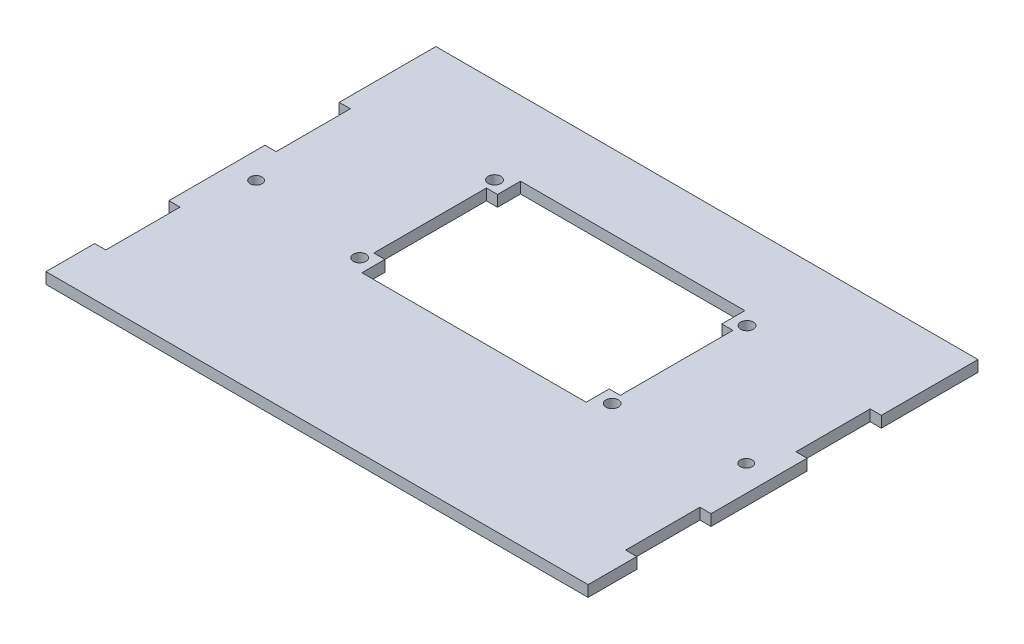
ISO-10303-21;
HEADER;
FILE_DESCRIPTION(('STEP AP214'),'2;1');
FILE_NAME('part.step','',(''),(''),'','','');
FILE_SCHEMA(('AUTOMOTIVE_DESIGN { 1 0 10303 214 1 1 1 1 }'));
ENDSEC;
DATA;
#1=APPLICATION_CONTEXT('core data for automotive mechanical design processes');
#2=APPLICATION_PROTOCOL_DEFINITION('international standard','automotive_design',2000,#1);
#3=PRODUCT_CONTEXT('',#1,'mechanical');
#4=PRODUCT('Part','Part','',(#3));
#5=PRODUCT_RELATED_PRODUCT_CATEGORY('part','',(#4));
#6=PRODUCT_DEFINITION_FORMATION('','',#4);
#7=PRODUCT_DEFINITION_CONTEXT('part definition',#1,'design');
#8=PRODUCT_DEFINITION('design','',#6,#7);
#9=PRODUCT_DEFINITION_SHAPE('','',#8);
#10=(LENGTH_UNIT() NAMED_UNIT(*) SI_UNIT(.MILLI.,.METRE.));
#11=(NAMED_UNIT(*) PLANE_ANGLE_UNIT() SI_UNIT($,.RADIAN.));
#12=(NAMED_UNIT(*) SI_UNIT($,.STERADIAN.) SOLID_ANGLE_UNIT());
#13=UNCERTAINTY_MEASURE_WITH_UNIT(LENGTH_MEASURE(1.E-05),#10,'distance_accuracy_value','');
#14=(GEOMETRIC_REPRESENTATION_CONTEXT(3) GLOBAL_UNCERTAINTY_ASSIGNED_CONTEXT((#13)) GLOBAL_UNIT_ASSIGNED_CONTEXT((#10,
#11,#12)) REPRESENTATION_CONTEXT('',''));
#15=CARTESIAN_POINT('',(0.,0.,0.));
#16=DIRECTION('',(0.,0.,1.));
#17=DIRECTION('',(1.,0.,0.));
#18=AXIS2_PLACEMENT_3D('',#15,#16,#17);
#19=CARTESIAN_POINT('',(-30.2,3.,10.22));
#20=DIRECTION('',(-1.,0.,0.));
#21=DIRECTION('',(0.,0.,1.));
#22=AXIS2_PLACEMENT_3D('',#19,#20,#21);
#23=PLANE('',#22);
#24=DIRECTION('',(0.,0.,-1.));
#25=VECTOR('',#24,1.);
#26=CARTESIAN_POINT('',(-30.2,3.,10.22));
#27=LINE('',#26,#25);
#28=CARTESIAN_POINT('',(-30.2,3.,-26.3));
#29=VERTEX_POINT('',#28);
#30=CARTESIAN_POINT('',(-30.2,3.,-32.5));
#31=VERTEX_POINT('',#30);
#32=EDGE_CURVE('E358',#29,#31,#27,.T.);
#33=ORIENTED_EDGE('',*,*,#32,.F.);
#34=DIRECTION('',(0.,-1.,0.));
#35=VECTOR('',#34,1.);
#36=CARTESIAN_POINT('',(-30.2,3.,-26.3));
#37=LINE('',#36,#35);
#38=CARTESIAN_POINT('',(-30.2,0.,-26.3));
#39=VERTEX_POINT('',#38);
#40=EDGE_CURVE('E302',#29,#39,#37,.T.);
#41=ORIENTED_EDGE('',*,*,#40,.T.);
#42=DIRECTION('',(0.,0.,-1.));
#43=VECTOR('',#42,1.);
#44=CARTESIAN_POINT('',(-30.2,0.,10.22));
#45=LINE('',#44,#43);
#46=CARTESIAN_POINT('',(-30.2,0.,-32.5));
#47=VERTEX_POINT('',#46);
#48=EDGE_CURVE('E374',#39,#47,#45,.T.);
#49=ORIENTED_EDGE('',*,*,#48,.T.);
#50=DIRECTION('',(0.,-1.,0.));
#51=VECTOR('',#50,1.);
#52=CARTESIAN_POINT('',(-30.2,3.,-32.5));
#53=LINE('',#52,#51);
#54=EDGE_CURVE('E306',#31,#47,#53,.T.);
#55=ORIENTED_EDGE('',*,*,#54,.F.);
#56=EDGE_LOOP('',(#33,#41,#49,#55));
#57=FACE_BOUND('',#56,.T.);
#58=ADVANCED_FACE('F50',(#57),#23,.F.);
#59=CARTESIAN_POINT('',(30.2,3.,-32.5));
#60=DIRECTION('',(1.,0.,0.));
#61=DIRECTION('',(0.,0.,-1.));
#62=AXIS2_PLACEMENT_3D('',#59,#60,#61);
#63=PLANE('',#62);
#64=DIRECTION('',(0.,0.,1.));
#65=VECTOR('',#64,1.);
#66=CARTESIAN_POINT('',(30.2,3.,-32.5));
#67=LINE('',#66,#65);
#68=CARTESIAN_POINT('',(30.2,3.,4.01999999999999));
#69=VERTEX_POINT('',#68);
#70=CARTESIAN_POINT('',(30.2,3.,10.22));
#71=VERTEX_POINT('',#70);
#72=EDGE_CURVE('E390',#69,#71,#67,.T.);
#73=ORIENTED_EDGE('',*,*,#72,.F.);
#74=DIRECTION('',(0.,-1.,0.));
#75=VECTOR('',#74,1.);
#76=CARTESIAN_POINT('',(30.2,3.,4.01999999999999));
#77=LINE('',#76,#75);
#78=CARTESIAN_POINT('',(30.2,0.,4.01999999999999));
#79=VERTEX_POINT('',#78);
#80=EDGE_CURVE('E321',#69,#79,#77,.T.);
#81=ORIENTED_EDGE('',*,*,#80,.T.);
#82=DIRECTION('',(0.,0.,1.));
#83=VECTOR('',#82,1.);
#84=CARTESIAN_POINT('',(30.2,0.,-32.5));
#85=LINE('',#84,#83);
#86=CARTESIAN_POINT('',(30.2,0.,10.22));
#87=VERTEX_POINT('',#86);
#88=EDGE_CURVE('E378',#79,#87,#85,.T.);
#89=ORIENTED_EDGE('',*,*,#88,.T.);
#90=DIRECTION('',(0.,-1.,0.));
#91=VECTOR('',#90,1.);
#92=CARTESIAN_POINT('',(30.2,3.,10.22));
#93=LINE('',#92,#91);
#94=EDGE_CURVE('E359',#71,#87,#93,.T.);
#95=ORIENTED_EDGE('',*,*,#94,.F.);
#96=EDGE_LOOP('',(#73,#81,#89,#95));
#97=FACE_BOUND('',#96,.T.);
#98=ADVANCED_FACE('F724',(#97),#63,.F.);
#99=CARTESIAN_POINT('',(-73.,3.,52.5));
#100=DIRECTION('',(1.,0.,0.));
#101=DIRECTION('',(0.,0.,-1.));
#102=AXIS2_PLACEMENT_3D('',#99,#100,#101);
#103=PLANE('',#102);
#104=DIRECTION('',(0.,0.,1.));
#105=VECTOR('',#104,1.);
#106=CARTESIAN_POINT('',(-73.,0.,52.5));
#107=LINE('',#106,#105);
#108=CARTESIAN_POINT('',(-73.,0.,-6.46999999999998));
#109=VERTEX_POINT('',#108);
#110=CARTESIAN_POINT('',(-73.,0.,19.4));
#111=VERTEX_POINT('',#110);
#112=EDGE_CURVE('E543',#109,#111,#107,.T.);
#113=ORIENTED_EDGE('',*,*,#112,.T.);
#114=DIRECTION('',(0.,1.,0.));
#115=VECTOR('',#114,1.);
#116=CARTESIAN_POINT('',(-73.,-7.,19.4));
#117=LINE('',#116,#115);
#118=CARTESIAN_POINT('',(-73.,3.,19.4));
#119=VERTEX_POINT('',#118);
#120=EDGE_CURVE('E473',#111,#119,#117,.T.);
#121=ORIENTED_EDGE('',*,*,#120,.T.);
#122=DIRECTION('',(0.,0.,1.));
#123=VECTOR('',#122,1.);
#124=CARTESIAN_POINT('',(-73.,3.,52.5));
#125=LINE('',#124,#123);
#126=CARTESIAN_POINT('',(-73.,3.,-6.46999999999998));
#127=VERTEX_POINT('',#126);
#128=EDGE_CURVE('E524',#127,#119,#125,.T.);
#129=ORIENTED_EDGE('',*,*,#128,.F.);
#130=DIRECTION('',(0.,1.,0.));
#131=VECTOR('',#130,1.);
#132=CARTESIAN_POINT('',(-73.,-7.,-6.46999999999998));
#133=LINE('',#132,#131);
#134=EDGE_CURVE('E513',#109,#127,#133,.T.);
#135=ORIENTED_EDGE('',*,*,#134,.F.);
#136=EDGE_LOOP('',(#113,#121,#129,#135));
#137=FACE_BOUND('',#136,.T.);
#138=ADVANCED_FACE('F627',(#137),#103,.F.);
#139=CARTESIAN_POINT('',(-73.,0.,-52.5));
#140=VERTEX_POINT('',#139);
#141=CARTESIAN_POINT('',(-73.,0.,-26.47));
#142=VERTEX_POINT('',#141);
#143=EDGE_CURVE('E538',#140,#142,#107,.T.);
#144=ORIENTED_EDGE('',*,*,#143,.T.);
#145=DIRECTION('',(0.,1.,0.));
#146=VECTOR('',#145,1.);
#147=CARTESIAN_POINT('',(-73.,-7.,-26.47));
#148=LINE('',#147,#146);
#149=CARTESIAN_POINT('',(-73.,3.,-26.47));
#150=VERTEX_POINT('',#149);
#151=EDGE_CURVE('E505',#142,#150,#148,.T.);
#152=ORIENTED_EDGE('',*,*,#151,.T.);
#153=CARTESIAN_POINT('',(-73.,3.,-52.5));
#154=VERTEX_POINT('',#153);
#155=EDGE_CURVE('E519',#154,#150,#125,.T.);
#156=ORIENTED_EDGE('',*,*,#155,.F.);
#157=DIRECTION('',(0.,-1.,0.));
#158=VECTOR('',#157,1.);
#159=CARTESIAN_POINT('',(-73.,3.,-52.5));
#160=LINE('',#159,#158);
#161=EDGE_CURVE('E537',#154,#140,#160,.T.);
#162=ORIENTED_EDGE('',*,*,#161,.T.);
#163=EDGE_LOOP('',(#144,#152,#156,#162));
#164=FACE_BOUND('',#163,.T.);
#165=ADVANCED_FACE('F686',(#164),#103,.F.);
#166=CARTESIAN_POINT('',(73.,3.,52.5));
#167=DIRECTION('',(-1.,0.,0.));
#168=DIRECTION('',(0.,0.,1.));
#169=AXIS2_PLACEMENT_3D('',#166,#167,#168);
#170=PLANE('',#169);
#171=DIRECTION('',(0.,0.,-1.));
#172=VECTOR('',#171,1.);
#173=CARTESIAN_POINT('',(73.,0.,52.5));
#174=LINE('',#173,#172);
#175=CARTESIAN_POINT('',(73.,0.,52.5));
#176=VERTEX_POINT('',#175);
#177=CARTESIAN_POINT('',(73.,0.,39.4));
#178=VERTEX_POINT('',#177);
#179=EDGE_CURVE('E547',#176,#178,#174,.T.);
#180=ORIENTED_EDGE('',*,*,#179,.T.);
#181=DIRECTION('',(0.,1.,0.));
#182=VECTOR('',#181,1.);
#183=CARTESIAN_POINT('',(73.,-7.,39.4));
#184=LINE('',#183,#182);
#185=CARTESIAN_POINT('',(73.,3.,39.4));
#186=VERTEX_POINT('',#185);
#187=EDGE_CURVE('E449',#178,#186,#184,.T.);
#188=ORIENTED_EDGE('',*,*,#187,.T.);
#189=DIRECTION('',(0.,0.,-1.));
#190=VECTOR('',#189,1.);
#191=CARTESIAN_POINT('',(73.,3.,52.5));
#192=LINE('',#191,#190);
#193=CARTESIAN_POINT('',(73.,3.,52.5));
#194=VERTEX_POINT('',#193);
#195=EDGE_CURVE('E529',#194,#186,#192,.T.);
#196=ORIENTED_EDGE('',*,*,#195,.F.);
#197=DIRECTION('',(0.,-1.,0.));
#198=VECTOR('',#197,1.);
#199=CARTESIAN_POINT('',(73.,3.,52.5));
#200=LINE('',#199,#198);
#201=EDGE_CURVE('E562',#194,#176,#200,.T.);
#202=ORIENTED_EDGE('',*,*,#201,.T.);
#203=EDGE_LOOP('',(#180,#188,#196,#202));
#204=FACE_BOUND('',#203,.T.);
#205=ADVANCED_FACE('F648',(#204),#170,.F.);
#206=CARTESIAN_POINT('',(73.,3.,19.4));
#207=VERTEX_POINT('',#206);
#208=CARTESIAN_POINT('',(73.,3.,-6.46999999999997));
#209=VERTEX_POINT('',#208);
#210=EDGE_CURVE('E534',#207,#209,#192,.T.);
#211=ORIENTED_EDGE('',*,*,#210,.F.);
#212=DIRECTION('',(0.,1.,0.));
#213=VECTOR('',#212,1.);
#214=CARTESIAN_POINT('',(73.,-7.,19.4));
#215=LINE('',#214,#213);
#216=CARTESIAN_POINT('',(73.,0.,19.4));
#217=VERTEX_POINT('',#216);
#218=EDGE_CURVE('E454',#217,#207,#215,.T.);
#219=ORIENTED_EDGE('',*,*,#218,.F.);
#220=CARTESIAN_POINT('',(73.,0.,-6.46999999999997));
#221=VERTEX_POINT('',#220);
#222=EDGE_CURVE('E552',#217,#221,#174,.T.);
#223=ORIENTED_EDGE('',*,*,#222,.T.);
#224=DIRECTION('',(0.,1.,0.));
#225=VECTOR('',#224,1.);
#226=CARTESIAN_POINT('',(73.,-7.,-6.46999999999997));
#227=LINE('',#226,#225);
#228=EDGE_CURVE('E423',#221,#209,#227,.T.);
#229=ORIENTED_EDGE('',*,*,#228,.T.);
#230=EDGE_LOOP('',(#211,#219,#223,#229));
#231=FACE_BOUND('',#230,.T.);
#232=ADVANCED_FACE('F665',(#231),#170,.F.);
#233=CARTESIAN_POINT('',(-73.,3.,39.4));
#234=VERTEX_POINT('',#233);
#235=CARTESIAN_POINT('',(-73.,3.,52.5));
#236=VERTEX_POINT('',#235);
#237=EDGE_CURVE('E525',#234,#236,#125,.T.);
#238=ORIENTED_EDGE('',*,*,#237,.F.);
#239=DIRECTION('',(0.,1.,0.));
#240=VECTOR('',#239,1.);
#241=CARTESIAN_POINT('',(-73.,-7.,39.4));
#242=LINE('',#241,#240);
#243=CARTESIAN_POINT('',(-73.,0.,39.4));
#244=VERTEX_POINT('',#243);
#245=EDGE_CURVE('E478',#244,#234,#242,.T.);
#246=ORIENTED_EDGE('',*,*,#245,.F.);
#247=CARTESIAN_POINT('',(-73.,0.,52.5));
#248=VERTEX_POINT('',#247);
#249=EDGE_CURVE('E509',#244,#248,#107,.T.);
#250=ORIENTED_EDGE('',*,*,#249,.T.);
#251=DIRECTION('',(0.,-1.,0.));
#252=VECTOR('',#251,1.);
#253=CARTESIAN_POINT('',(-73.,3.,52.5));
#254=LINE('',#253,#252);
#255=EDGE_CURVE('E566',#236,#248,#254,.T.);
#256=ORIENTED_EDGE('',*,*,#255,.F.);
#257=EDGE_LOOP('',(#238,#246,#250,#256));
#258=FACE_BOUND('',#257,.T.);
#259=ADVANCED_FACE('F52',(#258),#103,.F.);
#260=CARTESIAN_POINT('',(73.,3.,52.5));
#261=DIRECTION('',(0.,0.,-1.));
#262=DIRECTION('',(-1.,0.,0.));
#263=AXIS2_PLACEMENT_3D('',#260,#261,#262);
#264=PLANE('',#263);
#265=DIRECTION('',(1.,0.,0.));
#266=VECTOR('',#265,1.);
#267=CARTESIAN_POINT('',(73.,0.,52.5));
#268=LINE('',#267,#266);
#269=EDGE_CURVE('E542',#248,#176,#268,.T.);
#270=ORIENTED_EDGE('',*,*,#269,.T.);
#271=ORIENTED_EDGE('',*,*,#201,.F.);
#272=DIRECTION('',(1.,0.,0.));
#273=VECTOR('',#272,1.);
#274=CARTESIAN_POINT('',(73.,3.,52.5));
#275=LINE('',#274,#273);
#276=EDGE_CURVE('E523',#236,#194,#275,.T.);
#277=ORIENTED_EDGE('',*,*,#276,.F.);
#278=ORIENTED_EDGE('',*,*,#255,.T.);
#279=EDGE_LOOP('',(#270,#271,#277,#278));
#280=FACE_BOUND('',#279,.T.);
#281=ADVANCED_FACE('F642',(#280),#264,.F.);
#282=CARTESIAN_POINT('',(73.,3.,-26.47));
#283=VERTEX_POINT('',#282);
#284=CARTESIAN_POINT('',(73.,3.,-52.5));
#285=VERTEX_POINT('',#284);
#286=EDGE_CURVE('E528',#283,#285,#192,.T.);
#287=ORIENTED_EDGE('',*,*,#286,.F.);
#288=DIRECTION('',(0.,1.,0.));
#289=VECTOR('',#288,1.);
#290=CARTESIAN_POINT('',(73.,-7.,-26.47));
#291=LINE('',#290,#289);
#292=CARTESIAN_POINT('',(73.,0.,-26.47));
#293=VERTEX_POINT('',#292);
#294=EDGE_CURVE('E428',#293,#283,#291,.T.);
#295=ORIENTED_EDGE('',*,*,#294,.F.);
#296=CARTESIAN_POINT('',(73.,0.,-52.5));
#297=VERTEX_POINT('',#296);
#298=EDGE_CURVE('E546',#293,#297,#174,.T.);
#299=ORIENTED_EDGE('',*,*,#298,.T.);
#300=DIRECTION('',(0.,-1.,0.));
#301=VECTOR('',#300,1.);
#302=CARTESIAN_POINT('',(73.,3.,-52.5));
#303=LINE('',#302,#301);
#304=EDGE_CURVE('E558',#285,#297,#303,.T.);
#305=ORIENTED_EDGE('',*,*,#304,.F.);
#306=EDGE_LOOP('',(#287,#295,#299,#305));
#307=FACE_BOUND('',#306,.T.);
#308=ADVANCED_FACE('F678',(#307),#170,.F.);
#309=CARTESIAN_POINT('',(73.,3.,-52.5));
#310=DIRECTION('',(0.,0.,1.));
#311=DIRECTION('',(1.,0.,0.));
#312=AXIS2_PLACEMENT_3D('',#309,#310,#311);
#313=PLANE('',#312);
#314=DIRECTION('',(-1.,0.,0.));
#315=VECTOR('',#314,1.);
#316=CARTESIAN_POINT('',(73.,0.,-52.5));
#317=LINE('',#316,#315);
#318=EDGE_CURVE('E551',#297,#140,#317,.T.);
#319=ORIENTED_EDGE('',*,*,#318,.T.);
#320=ORIENTED_EDGE('',*,*,#161,.F.);
#321=DIRECTION('',(-1.,0.,0.));
#322=VECTOR('',#321,1.);
#323=CARTESIAN_POINT('',(73.,3.,-52.5));
#324=LINE('',#323,#322);
#325=EDGE_CURVE('E533',#285,#154,#324,.T.);
#326=ORIENTED_EDGE('',*,*,#325,.F.);
#327=ORIENTED_EDGE('',*,*,#304,.T.);
#328=EDGE_LOOP('',(#319,#320,#326,#327));
#329=FACE_BOUND('',#328,.T.);
#330=ADVANCED_FACE('F682',(#329),#313,.F.);
#331=CARTESIAN_POINT('',(0.,3.,0.));
#332=DIRECTION('',(0.,1.,0.));
#333=DIRECTION('',(0.,0.,1.));
#334=AXIS2_PLACEMENT_3D('',#331,#332,#333);
#335=PLANE('',#334);
#336=CARTESIAN_POINT('',(-66.,3.,2.92000000000003));
#337=DIRECTION('',(0.,1.,0.));
#338=DIRECTION('',(0.,0.,1.));
#339=AXIS2_PLACEMENT_3D('',#336,#337,#338);
#340=CIRCLE('',#339,1.60000000000001);
#341=CARTESIAN_POINT('',(-66.,3.,4.52000000000003));
#342=VERTEX_POINT('',#341);
#343=EDGE_CURVE('E292',#342,#342,#340,.T.);
#344=ORIENTED_EDGE('',*,*,#343,.F.);
#345=EDGE_LOOP('',(#344));
#346=FACE_BOUND('',#345,.T.);
#347=CARTESIAN_POINT('',(66.,3.,2.92000000000003));
#348=DIRECTION('',(0.,1.,0.));
#349=DIRECTION('',(0.,0.,1.));
#350=AXIS2_PLACEMENT_3D('',#347,#348,#349);
#351=CIRCLE('',#350,1.60000000000001);
#352=CARTESIAN_POINT('',(66.,3.,4.52000000000003));
#353=VERTEX_POINT('',#352);
#354=EDGE_CURVE('E1038',#353,#353,#351,.T.);
#355=ORIENTED_EDGE('',*,*,#354,.F.);
#356=EDGE_LOOP('',(#355));
#357=FACE_BOUND('',#356,.T.);
#358=DIRECTION('',(1.,0.,0.));
#359=VECTOR('',#358,1.);
#360=CARTESIAN_POINT('',(-33.2,3.,-26.3));
#361=LINE('',#360,#359);
#362=CARTESIAN_POINT('',(-33.2,3.,-26.3));
#363=VERTEX_POINT('',#362);
#364=EDGE_CURVE('E277',#363,#29,#361,.T.);
#365=ORIENTED_EDGE('',*,*,#364,.T.);
#366=ORIENTED_EDGE('',*,*,#32,.T.);
#367=DIRECTION('',(1.,0.,0.));
#368=VECTOR('',#367,1.);
#369=CARTESIAN_POINT('',(-30.2,3.,-32.5));
#370=LINE('',#369,#368);
#371=CARTESIAN_POINT('',(30.2,3.,-32.5));
#372=VERTEX_POINT('',#371);
#373=EDGE_CURVE('E395',#31,#372,#370,.T.);
#374=ORIENTED_EDGE('',*,*,#373,.T.);
#375=CARTESIAN_POINT('',(30.2,3.,-26.3));
#376=VERTEX_POINT('',#375);
#377=EDGE_CURVE('E391',#372,#376,#67,.T.);
#378=ORIENTED_EDGE('',*,*,#377,.T.);
#379=DIRECTION('',(1.,0.,0.));
#380=VECTOR('',#379,1.);
#381=CARTESIAN_POINT('',(33.2,3.,-26.3));
#382=LINE('',#381,#380);
#383=CARTESIAN_POINT('',(33.2,3.,-26.3));
#384=VERTEX_POINT('',#383);
#385=EDGE_CURVE('E74',#376,#384,#382,.T.);
#386=ORIENTED_EDGE('',*,*,#385,.T.);
#387=DIRECTION('',(0.,0.,1.));
#388=VECTOR('',#387,1.);
#389=CARTESIAN_POINT('',(33.2,3.,4.01999999999998));
#390=LINE('',#389,#388);
#391=CARTESIAN_POINT('',(33.2,3.,4.01999999999998));
#392=VERTEX_POINT('',#391);
#393=EDGE_CURVE('E338',#384,#392,#390,.T.);
#394=ORIENTED_EDGE('',*,*,#393,.T.);
#395=DIRECTION('',(-1.,0.,0.));
#396=VECTOR('',#395,1.);
#397=CARTESIAN_POINT('',(30.2,3.,4.01999999999999));
#398=LINE('',#397,#396);
#399=EDGE_CURVE('E314',#392,#69,#398,.T.);
#400=ORIENTED_EDGE('',*,*,#399,.T.);
#401=ORIENTED_EDGE('',*,*,#72,.T.);
#402=DIRECTION('',(-1.,0.,0.));
#403=VECTOR('',#402,1.);
#404=CARTESIAN_POINT('',(30.2,3.,10.22));
#405=LINE('',#404,#403);
#406=CARTESIAN_POINT('',(-30.2,3.,10.22));
#407=VERTEX_POINT('',#406);
#408=EDGE_CURVE('E387',#71,#407,#405,.T.);
#409=ORIENTED_EDGE('',*,*,#408,.T.);
#410=CARTESIAN_POINT('',(-30.2,3.,4.02));
#411=VERTEX_POINT('',#410);
#412=EDGE_CURVE('E284',#407,#411,#27,.T.);
#413=ORIENTED_EDGE('',*,*,#412,.T.);
#414=DIRECTION('',(-1.,0.,0.));
#415=VECTOR('',#414,1.);
#416=CARTESIAN_POINT('',(-30.2,3.,4.02));
#417=LINE('',#416,#415);
#418=CARTESIAN_POINT('',(-33.2,3.,4.02));
#419=VERTEX_POINT('',#418);
#420=EDGE_CURVE('E66',#411,#419,#417,.T.);
#421=ORIENTED_EDGE('',*,*,#420,.T.);
#422=DIRECTION('',(0.,0.,-1.));
#423=VECTOR('',#422,1.);
#424=CARTESIAN_POINT('',(-33.2,3.,4.02));
#425=LINE('',#424,#423);
#426=EDGE_CURVE('E271',#419,#363,#425,.T.);
#427=ORIENTED_EDGE('',*,*,#426,.T.);
#428=EDGE_LOOP('',(#365,#366,#374,#378,#386,#394,#400,#401,#409,#413,#421,#427));
#429=FACE_BOUND('',#428,.T.);
#430=CARTESIAN_POINT('',(34.,3.,7.02));
#431=DIRECTION('',(0.,-1.,0.));
#432=DIRECTION('',(0.,0.,-1.));
#433=AXIS2_PLACEMENT_3D('',#430,#431,#432);
#434=CIRCLE('',#433,1.7);
#435=CARTESIAN_POINT('',(34.,3.,5.32));
#436=VERTEX_POINT('',#435);
#437=EDGE_CURVE('E404',#436,#436,#434,.T.);
#438=ORIENTED_EDGE('',*,*,#437,.T.);
#439=EDGE_LOOP('',(#438));
#440=FACE_BOUND('',#439,.T.);
#441=CARTESIAN_POINT('',(-34.,3.,-29.3));
#442=DIRECTION('',(0.,-1.,0.));
#443=DIRECTION('',(0.,0.,-1.));
#444=AXIS2_PLACEMENT_3D('',#441,#442,#443);
#445=CIRCLE('',#444,1.7);
#446=CARTESIAN_POINT('',(-34.,3.,-31.));
#447=VERTEX_POINT('',#446);
#448=EDGE_CURVE('E348',#447,#447,#445,.T.);
#449=ORIENTED_EDGE('',*,*,#448,.T.);
#450=EDGE_LOOP('',(#449));
#451=FACE_BOUND('',#450,.T.);
#452=CARTESIAN_POINT('',(-34.,3.,7.02));
#453=DIRECTION('',(0.,-1.,0.));
#454=DIRECTION('',(0.,0.,-1.));
#455=AXIS2_PLACEMENT_3D('',#452,#453,#454);
#456=CIRCLE('',#455,1.7);
#457=CARTESIAN_POINT('',(-34.,3.,5.32));
#458=VERTEX_POINT('',#457);
#459=EDGE_CURVE('E349',#458,#458,#456,.T.);
#460=ORIENTED_EDGE('',*,*,#459,.T.);
#461=EDGE_LOOP('',(#460));
#462=FACE_BOUND('',#461,.T.);
#463=CARTESIAN_POINT('',(34.,3.,-29.3));
#464=DIRECTION('',(0.,-1.,0.));
#465=DIRECTION('',(0.,0.,-1.));
#466=AXIS2_PLACEMENT_3D('',#463,#464,#465);
#467=CIRCLE('',#466,1.7);
#468=CARTESIAN_POINT('',(34.,3.,-31.));
#469=VERTEX_POINT('',#468);
#470=EDGE_CURVE('E415',#469,#469,#467,.T.);
#471=ORIENTED_EDGE('',*,*,#470,.T.);
#472=EDGE_LOOP('',(#471));
#473=FACE_BOUND('',#472,.T.);
#474=DIRECTION('',(-1.,0.,0.));
#475=VECTOR('',#474,1.);
#476=CARTESIAN_POINT('',(-70.,3.,19.4));
#477=LINE('',#476,#475);
#478=CARTESIAN_POINT('',(-70.,3.,19.4));
#479=VERTEX_POINT('',#478);
#480=EDGE_CURVE('E463',#479,#119,#477,.T.);
#481=ORIENTED_EDGE('',*,*,#480,.F.);
#482=DIRECTION('',(0.,0.,-1.));
#483=VECTOR('',#482,1.);
#484=CARTESIAN_POINT('',(-70.,3.,39.4));
#485=LINE('',#484,#483);
#486=CARTESIAN_POINT('',(-70.,3.,39.4));
#487=VERTEX_POINT('',#486);
#488=EDGE_CURVE('E477',#487,#479,#485,.T.);
#489=ORIENTED_EDGE('',*,*,#488,.F.);
#490=DIRECTION('',(1.,0.,0.));
#491=VECTOR('',#490,1.);
#492=CARTESIAN_POINT('',(-73.,3.,39.4));
#493=LINE('',#492,#491);
#494=EDGE_CURVE('E489',#234,#487,#493,.T.);
#495=ORIENTED_EDGE('',*,*,#494,.F.);
#496=ORIENTED_EDGE('',*,*,#237,.T.);
#497=ORIENTED_EDGE('',*,*,#276,.T.);
#498=ORIENTED_EDGE('',*,*,#195,.T.);
#499=DIRECTION('',(1.,0.,0.));
#500=VECTOR('',#499,1.);
#501=CARTESIAN_POINT('',(73.,3.,39.4));
#502=LINE('',#501,#500);
#503=CARTESIAN_POINT('',(70.,3.,39.4));
#504=VERTEX_POINT('',#503);
#505=EDGE_CURVE('E437',#504,#186,#502,.T.);
#506=ORIENTED_EDGE('',*,*,#505,.F.);
#507=DIRECTION('',(0.,0.,1.));
#508=VECTOR('',#507,1.);
#509=CARTESIAN_POINT('',(70.,3.,39.4));
#510=LINE('',#509,#508);
#511=CARTESIAN_POINT('',(70.,3.,19.4));
#512=VERTEX_POINT('',#511);
#513=EDGE_CURVE('E453',#512,#504,#510,.T.);
#514=ORIENTED_EDGE('',*,*,#513,.F.);
#515=DIRECTION('',(-1.,0.,0.));
#516=VECTOR('',#515,1.);
#517=CARTESIAN_POINT('',(70.,3.,19.4));
#518=LINE('',#517,#516);
#519=EDGE_CURVE('E467',#207,#512,#518,.T.);
#520=ORIENTED_EDGE('',*,*,#519,.F.);
#521=ORIENTED_EDGE('',*,*,#210,.T.);
#522=DIRECTION('',(1.,0.,0.));
#523=VECTOR('',#522,1.);
#524=CARTESIAN_POINT('',(73.,3.,-6.46999999999997));
#525=LINE('',#524,#523);
#526=CARTESIAN_POINT('',(70.,3.,-6.46999999999998));
#527=VERTEX_POINT('',#526);
#528=EDGE_CURVE('E445',#527,#209,#525,.T.);
#529=ORIENTED_EDGE('',*,*,#528,.F.);
#530=DIRECTION('',(0.,0.,1.));
#531=VECTOR('',#530,1.);
#532=CARTESIAN_POINT('',(70.,3.,-6.46999999999998));
#533=LINE('',#532,#531);
#534=CARTESIAN_POINT('',(70.,3.,-26.47));
#535=VERTEX_POINT('',#534);
#536=EDGE_CURVE('E427',#535,#527,#533,.T.);
#537=ORIENTED_EDGE('',*,*,#536,.F.);
#538=DIRECTION('',(-1.,0.,0.));
#539=VECTOR('',#538,1.);
#540=CARTESIAN_POINT('',(70.,3.,-26.47));
#541=LINE('',#540,#539);
#542=EDGE_CURVE('E441',#283,#535,#541,.T.);
#543=ORIENTED_EDGE('',*,*,#542,.F.);
#544=ORIENTED_EDGE('',*,*,#286,.T.);
#545=ORIENTED_EDGE('',*,*,#325,.T.);
#546=ORIENTED_EDGE('',*,*,#155,.T.);
#547=DIRECTION('',(-1.,0.,0.));
#548=VECTOR('',#547,1.);
#549=CARTESIAN_POINT('',(-70.,3.,-26.47));
#550=LINE('',#549,#548);
#551=CARTESIAN_POINT('',(-70.,3.,-26.47));
#552=VERTEX_POINT('',#551);
#553=EDGE_CURVE('E448',#552,#150,#550,.T.);
#554=ORIENTED_EDGE('',*,*,#553,.F.);
#555=DIRECTION('',(0.,0.,-1.));
#556=VECTOR('',#555,1.);
#557=CARTESIAN_POINT('',(-70.,3.,-26.47));
#558=LINE('',#557,#556);
#559=CARTESIAN_POINT('',(-70.,3.,-6.46999999999998));
#560=VERTEX_POINT('',#559);
#561=EDGE_CURVE('E501',#560,#552,#558,.T.);
#562=ORIENTED_EDGE('',*,*,#561,.F.);
#563=DIRECTION('',(1.,0.,0.));
#564=VECTOR('',#563,1.);
#565=CARTESIAN_POINT('',(-73.,3.,-6.46999999999998));
#566=LINE('',#565,#564);
#567=EDGE_CURVE('E497',#127,#560,#566,.T.);
#568=ORIENTED_EDGE('',*,*,#567,.F.);
#569=ORIENTED_EDGE('',*,*,#128,.T.);
#570=EDGE_LOOP('',(#481,#489,#495,#496,#497,#498,#506,#514,#520,#521,#529,#537,#543,#544,#545,
#546,#554,#562,#568,#569));
#571=FACE_BOUND('',#570,.T.);
#572=ADVANCED_FACE('F280',(#346,#357,#429,#440,#451,#462,#473,#571),#335,.T.);
#573=CARTESIAN_POINT('',(0.,0.,0.));
#574=DIRECTION('',(0.,1.,0.));
#575=DIRECTION('',(0.,0.,1.));
#576=AXIS2_PLACEMENT_3D('',#573,#574,#575);
#577=PLANE('',#576);
#578=CARTESIAN_POINT('',(-66.,0.,2.92000000000003));
#579=DIRECTION('',(0.,-1.,0.));
#580=DIRECTION('',(0.,0.,-1.));
#581=AXIS2_PLACEMENT_3D('',#578,#579,#580);
#582=CIRCLE('',#581,1.60000000000001);
#583=CARTESIAN_POINT('',(-66.,0.,1.32000000000002));
#584=VERTEX_POINT('',#583);
#585=EDGE_CURVE('E1036',#584,#584,#582,.T.);
#586=ORIENTED_EDGE('',*,*,#585,.F.);
#587=EDGE_LOOP('',(#586));
#588=FACE_BOUND('',#587,.T.);
#589=CARTESIAN_POINT('',(66.,0.,2.92000000000003));
#590=DIRECTION('',(0.,-1.,0.));
#591=DIRECTION('',(0.,0.,-1.));
#592=AXIS2_PLACEMENT_3D('',#589,#590,#591);
#593=CIRCLE('',#592,1.60000000000001);
#594=CARTESIAN_POINT('',(66.,0.,1.32000000000002));
#595=VERTEX_POINT('',#594);
#596=EDGE_CURVE('E1039',#595,#595,#593,.T.);
#597=ORIENTED_EDGE('',*,*,#596,.F.);
#598=EDGE_LOOP('',(#597));
#599=FACE_BOUND('',#598,.T.);
#600=CARTESIAN_POINT('',(34.,0.,7.02));
#601=DIRECTION('',(0.,-1.,0.));
#602=DIRECTION('',(0.,0.,-1.));
#603=AXIS2_PLACEMENT_3D('',#600,#601,#602);
#604=CIRCLE('',#603,1.7);
#605=CARTESIAN_POINT('',(34.,0.,5.32));
#606=VERTEX_POINT('',#605);
#607=EDGE_CURVE('E399',#606,#606,#604,.T.);
#608=ORIENTED_EDGE('',*,*,#607,.F.);
#609=EDGE_LOOP('',(#608));
#610=FACE_BOUND('',#609,.T.);
#611=CARTESIAN_POINT('',(-34.,0.,-29.3));
#612=DIRECTION('',(0.,-1.,0.));
#613=DIRECTION('',(0.,0.,-1.));
#614=AXIS2_PLACEMENT_3D('',#611,#612,#613);
#615=CIRCLE('',#614,1.7);
#616=CARTESIAN_POINT('',(-34.,0.,-31.));
#617=VERTEX_POINT('',#616);
#618=EDGE_CURVE('E408',#617,#617,#615,.T.);
#619=ORIENTED_EDGE('',*,*,#618,.F.);
#620=EDGE_LOOP('',(#619));
#621=FACE_BOUND('',#620,.T.);
#622=CARTESIAN_POINT('',(-34.,0.,7.02));
#623=DIRECTION('',(0.,-1.,0.));
#624=DIRECTION('',(0.,0.,-1.));
#625=AXIS2_PLACEMENT_3D('',#622,#623,#624);
#626=CIRCLE('',#625,1.7);
#627=CARTESIAN_POINT('',(-34.,0.,5.32));
#628=VERTEX_POINT('',#627);
#629=EDGE_CURVE('E344',#628,#628,#626,.T.);
#630=ORIENTED_EDGE('',*,*,#629,.F.);
#631=EDGE_LOOP('',(#630));
#632=FACE_BOUND('',#631,.T.);
#633=ORIENTED_EDGE('',*,*,#48,.F.);
#634=DIRECTION('',(1.,0.,0.));
#635=VECTOR('',#634,1.);
#636=CARTESIAN_POINT('',(-33.2,0.,-26.3));
#637=LINE('',#636,#635);
#638=CARTESIAN_POINT('',(-33.2,0.,-26.3));
#639=VERTEX_POINT('',#638);
#640=EDGE_CURVE('E286',#639,#39,#637,.T.);
#641=ORIENTED_EDGE('',*,*,#640,.F.);
#642=DIRECTION('',(0.,0.,-1.));
#643=VECTOR('',#642,1.);
#644=CARTESIAN_POINT('',(-33.2,0.,4.02));
#645=LINE('',#644,#643);
#646=CARTESIAN_POINT('',(-33.2,0.,4.02));
#647=VERTEX_POINT('',#646);
#648=EDGE_CURVE('E289',#647,#639,#645,.T.);
#649=ORIENTED_EDGE('',*,*,#648,.F.);
#650=DIRECTION('',(-1.,0.,0.));
#651=VECTOR('',#650,1.);
#652=CARTESIAN_POINT('',(-30.2,0.,4.02));
#653=LINE('',#652,#651);
#654=CARTESIAN_POINT('',(-30.2,0.,4.02));
#655=VERTEX_POINT('',#654);
#656=EDGE_CURVE('E262',#655,#647,#653,.T.);
#657=ORIENTED_EDGE('',*,*,#656,.F.);
#658=CARTESIAN_POINT('',(-30.2,0.,10.22));
#659=VERTEX_POINT('',#658);
#660=EDGE_CURVE('E369',#659,#655,#45,.T.);
#661=ORIENTED_EDGE('',*,*,#660,.F.);
#662=DIRECTION('',(-1.,0.,0.));
#663=VECTOR('',#662,1.);
#664=CARTESIAN_POINT('',(30.2,0.,10.22));
#665=LINE('',#664,#663);
#666=EDGE_CURVE('E373',#87,#659,#665,.T.);
#667=ORIENTED_EDGE('',*,*,#666,.F.);
#668=ORIENTED_EDGE('',*,*,#88,.F.);
#669=DIRECTION('',(-1.,0.,0.));
#670=VECTOR('',#669,1.);
#671=CARTESIAN_POINT('',(30.2,0.,4.01999999999999));
#672=LINE('',#671,#670);
#673=CARTESIAN_POINT('',(33.2,0.,4.01999999999998));
#674=VERTEX_POINT('',#673);
#675=EDGE_CURVE('E325',#674,#79,#672,.T.);
#676=ORIENTED_EDGE('',*,*,#675,.F.);
#677=DIRECTION('',(0.,0.,1.));
#678=VECTOR('',#677,1.);
#679=CARTESIAN_POINT('',(33.2,0.,4.01999999999998));
#680=LINE('',#679,#678);
#681=CARTESIAN_POINT('',(33.2,0.,-26.3));
#682=VERTEX_POINT('',#681);
#683=EDGE_CURVE('E328',#682,#674,#680,.T.);
#684=ORIENTED_EDGE('',*,*,#683,.F.);
#685=DIRECTION('',(1.,0.,0.));
#686=VECTOR('',#685,1.);
#687=CARTESIAN_POINT('',(33.2,0.,-26.3));
#688=LINE('',#687,#686);
#689=CARTESIAN_POINT('',(30.2,0.,-26.3));
#690=VERTEX_POINT('',#689);
#691=EDGE_CURVE('E299',#690,#682,#688,.T.);
#692=ORIENTED_EDGE('',*,*,#691,.F.);
#693=CARTESIAN_POINT('',(30.2,0.,-32.5));
#694=VERTEX_POINT('',#693);
#695=EDGE_CURVE('E379',#694,#690,#85,.T.);
#696=ORIENTED_EDGE('',*,*,#695,.F.);
#697=DIRECTION('',(1.,0.,0.));
#698=VECTOR('',#697,1.);
#699=CARTESIAN_POINT('',(-30.2,0.,-32.5));
#700=LINE('',#699,#698);
#701=EDGE_CURVE('E353',#47,#694,#700,.T.);
#702=ORIENTED_EDGE('',*,*,#701,.F.);
#703=EDGE_LOOP('',(#633,#641,#649,#657,#661,#667,#668,#676,#684,#692,#696,#702));
#704=FACE_BOUND('',#703,.T.);
#705=CARTESIAN_POINT('',(34.,0.,-29.3));
#706=DIRECTION('',(0.,-1.,0.));
#707=DIRECTION('',(0.,0.,-1.));
#708=AXIS2_PLACEMENT_3D('',#705,#706,#707);
#709=CIRCLE('',#708,1.7);
#710=CARTESIAN_POINT('',(34.,0.,-31.));
#711=VERTEX_POINT('',#710);
#712=EDGE_CURVE('E403',#711,#711,#709,.T.);
#713=ORIENTED_EDGE('',*,*,#712,.F.);
#714=EDGE_LOOP('',(#713));
#715=FACE_BOUND('',#714,.T.);
#716=DIRECTION('',(0.,0.,-1.));
#717=VECTOR('',#716,1.);
#718=CARTESIAN_POINT('',(-70.,0.,0.));
#719=LINE('',#718,#717);
#720=CARTESIAN_POINT('',(-70.,0.,39.4));
#721=VERTEX_POINT('',#720);
#722=CARTESIAN_POINT('',(-70.,0.,19.4));
#723=VERTEX_POINT('',#722);
#724=EDGE_CURVE('E59',#721,#723,#719,.T.);
#725=ORIENTED_EDGE('',*,*,#724,.T.);
#726=DIRECTION('',(-1.,0.,0.));
#727=VECTOR('',#726,1.);
#728=CARTESIAN_POINT('',(0.,0.,19.4));
#729=LINE('',#728,#727);
#730=EDGE_CURVE('E11',#723,#111,#729,.T.);
#731=ORIENTED_EDGE('',*,*,#730,.T.);
#732=ORIENTED_EDGE('',*,*,#112,.F.);
#733=DIRECTION('',(1.,0.,0.));
#734=VECTOR('',#733,1.);
#735=CARTESIAN_POINT('',(0.,0.,-6.46999999999998));
#736=LINE('',#735,#734);
#737=CARTESIAN_POINT('',(-70.,0.,-6.46999999999998));
#738=VERTEX_POINT('',#737);
#739=EDGE_CURVE('E570',#109,#738,#736,.T.);
#740=ORIENTED_EDGE('',*,*,#739,.T.);
#741=DIRECTION('',(0.,0.,-1.));
#742=VECTOR('',#741,1.);
#743=CARTESIAN_POINT('',(-70.,0.,0.));
#744=LINE('',#743,#742);
#745=CARTESIAN_POINT('',(-70.,0.,-26.47));
#746=VERTEX_POINT('',#745);
#747=EDGE_CURVE('E574',#738,#746,#744,.T.);
#748=ORIENTED_EDGE('',*,*,#747,.T.);
#749=DIRECTION('',(-1.,0.,0.));
#750=VECTOR('',#749,1.);
#751=CARTESIAN_POINT('',(0.,0.,-26.4700000000001));
#752=LINE('',#751,#750);
#753=EDGE_CURVE('E578',#746,#142,#752,.T.);
#754=ORIENTED_EDGE('',*,*,#753,.T.);
#755=ORIENTED_EDGE('',*,*,#143,.F.);
#756=ORIENTED_EDGE('',*,*,#318,.F.);
#757=ORIENTED_EDGE('',*,*,#298,.F.);
#758=DIRECTION('',(-1.,0.,0.));
#759=VECTOR('',#758,1.);
#760=CARTESIAN_POINT('',(0.,0.,-26.4700000000001));
#761=LINE('',#760,#759);
#762=CARTESIAN_POINT('',(70.,0.,-26.47));
#763=VERTEX_POINT('',#762);
#764=EDGE_CURVE('E582',#293,#763,#761,.T.);
#765=ORIENTED_EDGE('',*,*,#764,.T.);
#766=DIRECTION('',(0.,0.,1.));
#767=VECTOR('',#766,1.);
#768=CARTESIAN_POINT('',(70.,0.,0.));
#769=LINE('',#768,#767);
#770=CARTESIAN_POINT('',(70.,0.,-6.46999999999998));
#771=VERTEX_POINT('',#770);
#772=EDGE_CURVE('E586',#763,#771,#769,.T.);
#773=ORIENTED_EDGE('',*,*,#772,.T.);
#774=DIRECTION('',(1.,0.,0.));
#775=VECTOR('',#774,1.);
#776=CARTESIAN_POINT('',(0.,0.,-6.47));
#777=LINE('',#776,#775);
#778=EDGE_CURVE('E590',#771,#221,#777,.T.);
#779=ORIENTED_EDGE('',*,*,#778,.T.);
#780=ORIENTED_EDGE('',*,*,#222,.F.);
#781=DIRECTION('',(-1.,0.,0.));
#782=VECTOR('',#781,1.);
#783=CARTESIAN_POINT('',(0.,0.,19.4));
#784=LINE('',#783,#782);
#785=CARTESIAN_POINT('',(70.,0.,19.4));
#786=VERTEX_POINT('',#785);
#787=EDGE_CURVE('E594',#217,#786,#784,.T.);
#788=ORIENTED_EDGE('',*,*,#787,.T.);
#789=DIRECTION('',(0.,0.,1.));
#790=VECTOR('',#789,1.);
#791=CARTESIAN_POINT('',(70.,0.,0.));
#792=LINE('',#791,#790);
#793=CARTESIAN_POINT('',(70.,0.,39.4));
#794=VERTEX_POINT('',#793);
#795=EDGE_CURVE('E598',#786,#794,#792,.T.);
#796=ORIENTED_EDGE('',*,*,#795,.T.);
#797=DIRECTION('',(1.,0.,0.));
#798=VECTOR('',#797,1.);
#799=CARTESIAN_POINT('',(0.,0.,39.4));
#800=LINE('',#799,#798);
#801=EDGE_CURVE('E602',#794,#178,#800,.T.);
#802=ORIENTED_EDGE('',*,*,#801,.T.);
#803=ORIENTED_EDGE('',*,*,#179,.F.);
#804=ORIENTED_EDGE('',*,*,#269,.F.);
#805=ORIENTED_EDGE('',*,*,#249,.F.);
#806=DIRECTION('',(1.,0.,0.));
#807=VECTOR('',#806,1.);
#808=CARTESIAN_POINT('',(0.,0.,39.4));
#809=LINE('',#808,#807);
#810=EDGE_CURVE('E606',#244,#721,#809,.T.);
#811=ORIENTED_EDGE('',*,*,#810,.T.);
#812=EDGE_LOOP('',(#725,#731,#732,#740,#748,#754,#755,#756,#757,#765,#773,#779,#780,#788,#796,
#802,#803,#804,#805,#811));
#813=FACE_BOUND('',#812,.T.);
#814=ADVANCED_FACE('F613',(#588,#599,#610,#621,#632,#704,#715,#813),#577,.F.);
#815=CARTESIAN_POINT('',(-70.,-7.,-26.47));
#816=DIRECTION('',(0.,0.,-1.));
#817=DIRECTION('',(-1.,0.,0.));
#818=AXIS2_PLACEMENT_3D('',#815,#816,#817);
#819=PLANE('',#818);
#820=DIRECTION('',(0.,1.,0.));
#821=VECTOR('',#820,1.);
#822=CARTESIAN_POINT('',(-70.,-7.,-26.47));
#823=LINE('',#822,#821);
#824=EDGE_CURVE('E506',#746,#552,#823,.T.);
#825=ORIENTED_EDGE('',*,*,#824,.T.);
#826=ORIENTED_EDGE('',*,*,#553,.T.);
#827=ORIENTED_EDGE('',*,*,#151,.F.);
#828=ORIENTED_EDGE('',*,*,#753,.F.);
#829=EDGE_LOOP('',(#825,#826,#827,#828));
#830=FACE_BOUND('',#829,.T.);
#831=ADVANCED_FACE('F689',(#830),#819,.F.);
#832=CARTESIAN_POINT('',(-70.,-7.,-26.47));
#833=DIRECTION('',(1.,0.,0.));
#834=DIRECTION('',(0.,0.,-1.));
#835=AXIS2_PLACEMENT_3D('',#832,#833,#834);
#836=PLANE('',#835);
#837=DIRECTION('',(0.,1.,0.));
#838=VECTOR('',#837,1.);
#839=CARTESIAN_POINT('',(-70.,-7.,-6.46999999999998));
#840=LINE('',#839,#838);
#841=EDGE_CURVE('E510',#738,#560,#840,.T.);
#842=ORIENTED_EDGE('',*,*,#841,.T.);
#843=ORIENTED_EDGE('',*,*,#561,.T.);
#844=ORIENTED_EDGE('',*,*,#824,.F.);
#845=ORIENTED_EDGE('',*,*,#747,.F.);
#846=EDGE_LOOP('',(#842,#843,#844,#845));
#847=FACE_BOUND('',#846,.T.);
#848=ADVANCED_FACE('F693',(#847),#836,.F.);
#849=CARTESIAN_POINT('',(-73.,-7.,-6.46999999999998));
#850=DIRECTION('',(0.,0.,1.));
#851=DIRECTION('',(1.,0.,0.));
#852=AXIS2_PLACEMENT_3D('',#849,#850,#851);
#853=PLANE('',#852);
#854=ORIENTED_EDGE('',*,*,#134,.T.);
#855=ORIENTED_EDGE('',*,*,#567,.T.);
#856=ORIENTED_EDGE('',*,*,#841,.F.);
#857=ORIENTED_EDGE('',*,*,#739,.F.);
#858=EDGE_LOOP('',(#854,#855,#856,#857));
#859=FACE_BOUND('',#858,.T.);
#860=ADVANCED_FACE('F695',(#859),#853,.F.);
#861=CARTESIAN_POINT('',(73.,-7.,-6.46999999999997));
#862=DIRECTION('',(0.,0.,1.));
#863=DIRECTION('',(1.,0.,0.));
#864=AXIS2_PLACEMENT_3D('',#861,#862,#863);
#865=PLANE('',#864);
#866=DIRECTION('',(0.,1.,0.));
#867=VECTOR('',#866,1.);
#868=CARTESIAN_POINT('',(70.,-7.,-6.46999999999998));
#869=LINE('',#868,#867);
#870=EDGE_CURVE('E434',#771,#527,#869,.T.);
#871=ORIENTED_EDGE('',*,*,#870,.T.);
#872=ORIENTED_EDGE('',*,*,#528,.T.);
#873=ORIENTED_EDGE('',*,*,#228,.F.);
#874=ORIENTED_EDGE('',*,*,#778,.F.);
#875=EDGE_LOOP('',(#871,#872,#873,#874));
#876=FACE_BOUND('',#875,.T.);
#877=ADVANCED_FACE('F862',(#876),#865,.F.);
#878=CARTESIAN_POINT('',(70.,-7.,-6.46999999999998));
#879=DIRECTION('',(-1.,0.,0.));
#880=DIRECTION('',(0.,0.,1.));
#881=AXIS2_PLACEMENT_3D('',#878,#879,#880);
#882=PLANE('',#881);
#883=DIRECTION('',(0.,1.,0.));
#884=VECTOR('',#883,1.);
#885=CARTESIAN_POINT('',(70.,-7.,-26.47));
#886=LINE('',#885,#884);
#887=EDGE_CURVE('E431',#763,#535,#886,.T.);
#888=ORIENTED_EDGE('',*,*,#887,.T.);
#889=ORIENTED_EDGE('',*,*,#536,.T.);
#890=ORIENTED_EDGE('',*,*,#870,.F.);
#891=ORIENTED_EDGE('',*,*,#772,.F.);
#892=EDGE_LOOP('',(#888,#889,#890,#891));
#893=FACE_BOUND('',#892,.T.);
#894=ADVANCED_FACE('F870',(#893),#882,.F.);
#895=CARTESIAN_POINT('',(70.,-7.,-26.47));
#896=DIRECTION('',(0.,0.,-1.));
#897=DIRECTION('',(-1.,0.,0.));
#898=AXIS2_PLACEMENT_3D('',#895,#896,#897);
#899=PLANE('',#898);
#900=ORIENTED_EDGE('',*,*,#294,.T.);
#901=ORIENTED_EDGE('',*,*,#542,.T.);
#902=ORIENTED_EDGE('',*,*,#887,.F.);
#903=ORIENTED_EDGE('',*,*,#764,.F.);
#904=EDGE_LOOP('',(#900,#901,#902,#903));
#905=FACE_BOUND('',#904,.T.);
#906=ADVANCED_FACE('F879',(#905),#899,.F.);
#907=CARTESIAN_POINT('',(73.,-7.,39.4));
#908=DIRECTION('',(0.,0.,1.));
#909=DIRECTION('',(1.,0.,0.));
#910=AXIS2_PLACEMENT_3D('',#907,#908,#909);
#911=PLANE('',#910);
#912=DIRECTION('',(0.,1.,0.));
#913=VECTOR('',#912,1.);
#914=CARTESIAN_POINT('',(70.,-7.,39.4));
#915=LINE('',#914,#913);
#916=EDGE_CURVE('E460',#794,#504,#915,.T.);
#917=ORIENTED_EDGE('',*,*,#916,.T.);
#918=ORIENTED_EDGE('',*,*,#505,.T.);
#919=ORIENTED_EDGE('',*,*,#187,.F.);
#920=ORIENTED_EDGE('',*,*,#801,.F.);
#921=EDGE_LOOP('',(#917,#918,#919,#920));
#922=FACE_BOUND('',#921,.T.);
#923=ADVANCED_FACE('F653',(#922),#911,.F.);
#924=CARTESIAN_POINT('',(70.,-7.,39.4));
#925=DIRECTION('',(-1.,0.,0.));
#926=DIRECTION('',(0.,0.,1.));
#927=AXIS2_PLACEMENT_3D('',#924,#925,#926);
#928=PLANE('',#927);
#929=DIRECTION('',(0.,1.,0.));
#930=VECTOR('',#929,1.);
#931=CARTESIAN_POINT('',(70.,-7.,19.4));
#932=LINE('',#931,#930);
#933=EDGE_CURVE('E457',#786,#512,#932,.T.);
#934=ORIENTED_EDGE('',*,*,#933,.T.);
#935=ORIENTED_EDGE('',*,*,#513,.T.);
#936=ORIENTED_EDGE('',*,*,#916,.F.);
#937=ORIENTED_EDGE('',*,*,#795,.F.);
#938=EDGE_LOOP('',(#934,#935,#936,#937));
#939=FACE_BOUND('',#938,.T.);
#940=ADVANCED_FACE('F657',(#939),#928,.F.);
#941=CARTESIAN_POINT('',(70.,-7.,19.4));
#942=DIRECTION('',(0.,0.,-1.));
#943=DIRECTION('',(-1.,0.,0.));
#944=AXIS2_PLACEMENT_3D('',#941,#942,#943);
#945=PLANE('',#944);
#946=ORIENTED_EDGE('',*,*,#218,.T.);
#947=ORIENTED_EDGE('',*,*,#519,.T.);
#948=ORIENTED_EDGE('',*,*,#933,.F.);
#949=ORIENTED_EDGE('',*,*,#787,.F.);
#950=EDGE_LOOP('',(#946,#947,#948,#949));
#951=FACE_BOUND('',#950,.T.);
#952=ADVANCED_FACE('F659',(#951),#945,.F.);
#953=CARTESIAN_POINT('',(-70.,-7.,19.4));
#954=DIRECTION('',(0.,0.,-1.));
#955=DIRECTION('',(-1.,0.,0.));
#956=AXIS2_PLACEMENT_3D('',#953,#954,#955);
#957=PLANE('',#956);
#958=DIRECTION('',(0.,1.,0.));
#959=VECTOR('',#958,1.);
#960=CARTESIAN_POINT('',(-70.,-7.,19.4));
#961=LINE('',#960,#959);
#962=EDGE_CURVE('E419',#723,#479,#961,.T.);
#963=ORIENTED_EDGE('',*,*,#962,.T.);
#964=ORIENTED_EDGE('',*,*,#480,.T.);
#965=ORIENTED_EDGE('',*,*,#120,.F.);
#966=ORIENTED_EDGE('',*,*,#730,.F.);
#967=EDGE_LOOP('',(#963,#964,#965,#966));
#968=FACE_BOUND('',#967,.T.);
#969=ADVANCED_FACE('F623',(#968),#957,.F.);
#970=CARTESIAN_POINT('',(-70.,-7.,39.4));
#971=DIRECTION('',(1.,0.,0.));
#972=DIRECTION('',(0.,0.,-1.));
#973=AXIS2_PLACEMENT_3D('',#970,#971,#972);
#974=PLANE('',#973);
#975=DIRECTION('',(0.,1.,0.));
#976=VECTOR('',#975,1.);
#977=CARTESIAN_POINT('',(-70.,-7.,39.4));
#978=LINE('',#977,#976);
#979=EDGE_CURVE('E481',#721,#487,#978,.T.);
#980=ORIENTED_EDGE('',*,*,#979,.T.);
#981=ORIENTED_EDGE('',*,*,#488,.T.);
#982=ORIENTED_EDGE('',*,*,#962,.F.);
#983=ORIENTED_EDGE('',*,*,#724,.F.);
#984=EDGE_LOOP('',(#980,#981,#982,#983));
#985=FACE_BOUND('',#984,.T.);
#986=ADVANCED_FACE('F619',(#985),#974,.F.);
#987=CARTESIAN_POINT('',(-73.,-7.,39.4));
#988=DIRECTION('',(0.,0.,1.));
#989=DIRECTION('',(1.,0.,0.));
#990=AXIS2_PLACEMENT_3D('',#987,#988,#989);
#991=PLANE('',#990);
#992=ORIENTED_EDGE('',*,*,#245,.T.);
#993=ORIENTED_EDGE('',*,*,#494,.T.);
#994=ORIENTED_EDGE('',*,*,#979,.F.);
#995=ORIENTED_EDGE('',*,*,#810,.F.);
#996=EDGE_LOOP('',(#992,#993,#994,#995));
#997=FACE_BOUND('',#996,.T.);
#998=ADVANCED_FACE('F768',(#997),#991,.F.);
#999=CARTESIAN_POINT('',(34.,3.,-29.3));
#1000=DIRECTION('',(0.,-1.,0.));
#1001=DIRECTION('',(0.,0.,-1.));
#1002=AXIS2_PLACEMENT_3D('',#999,#1000,#1001);
#1003=CYLINDRICAL_SURFACE('',#1002,1.7);
#1004=ORIENTED_EDGE('',*,*,#470,.F.);
#1005=EDGE_LOOP('',(#1004));
#1006=FACE_BOUND('',#1005,.T.);
#1007=ORIENTED_EDGE('',*,*,#712,.T.);
#1008=EDGE_LOOP('',(#1007));
#1009=FACE_BOUND('',#1008,.T.);
#1010=ADVANCED_FACE('F763',(#1006,#1009),#1003,.F.);
#1011=CARTESIAN_POINT('',(-30.2,3.,-32.5));
#1012=DIRECTION('',(0.,0.,-1.));
#1013=DIRECTION('',(-1.,0.,0.));
#1014=AXIS2_PLACEMENT_3D('',#1011,#1012,#1013);
#1015=PLANE('',#1014);
#1016=ORIENTED_EDGE('',*,*,#701,.T.);
#1017=DIRECTION('',(0.,-1.,0.));
#1018=VECTOR('',#1017,1.);
#1019=CARTESIAN_POINT('',(30.2,3.,-32.5));
#1020=LINE('',#1019,#1018);
#1021=EDGE_CURVE('E354',#372,#694,#1020,.T.);
#1022=ORIENTED_EDGE('',*,*,#1021,.F.);
#1023=ORIENTED_EDGE('',*,*,#373,.F.);
#1024=ORIENTED_EDGE('',*,*,#54,.T.);
#1025=EDGE_LOOP('',(#1016,#1022,#1023,#1024));
#1026=FACE_BOUND('',#1025,.T.);
#1027=ADVANCED_FACE('F708',(#1026),#1015,.F.);
#1028=ORIENTED_EDGE('',*,*,#660,.T.);
#1029=DIRECTION('',(0.,-1.,0.));
#1030=VECTOR('',#1029,1.);
#1031=CARTESIAN_POINT('',(-30.2,3.,4.02));
#1032=LINE('',#1031,#1030);
#1033=EDGE_CURVE('E268',#411,#655,#1032,.T.);
#1034=ORIENTED_EDGE('',*,*,#1033,.F.);
#1035=ORIENTED_EDGE('',*,*,#412,.F.);
#1036=DIRECTION('',(0.,-1.,0.));
#1037=VECTOR('',#1036,1.);
#1038=CARTESIAN_POINT('',(-30.2,3.,10.22));
#1039=LINE('',#1038,#1037);
#1040=EDGE_CURVE('E363',#407,#659,#1039,.T.);
#1041=ORIENTED_EDGE('',*,*,#1040,.T.);
#1042=EDGE_LOOP('',(#1028,#1034,#1035,#1041));
#1043=FACE_BOUND('',#1042,.T.);
#1044=ADVANCED_FACE('F734',(#1043),#23,.F.);
#1045=CARTESIAN_POINT('',(30.2,3.,10.22));
#1046=DIRECTION('',(0.,0.,1.));
#1047=DIRECTION('',(1.,0.,0.));
#1048=AXIS2_PLACEMENT_3D('',#1045,#1046,#1047);
#1049=PLANE('',#1048);
#1050=ORIENTED_EDGE('',*,*,#666,.T.);
#1051=ORIENTED_EDGE('',*,*,#1040,.F.);
#1052=ORIENTED_EDGE('',*,*,#408,.F.);
#1053=ORIENTED_EDGE('',*,*,#94,.T.);
#1054=EDGE_LOOP('',(#1050,#1051,#1052,#1053));
#1055=FACE_BOUND('',#1054,.T.);
#1056=ADVANCED_FACE('F731',(#1055),#1049,.F.);
#1057=ORIENTED_EDGE('',*,*,#695,.T.);
#1058=DIRECTION('',(0.,-1.,0.));
#1059=VECTOR('',#1058,1.);
#1060=CARTESIAN_POINT('',(30.2,3.,-26.3));
#1061=LINE('',#1060,#1059);
#1062=EDGE_CURVE('E311',#376,#690,#1061,.T.);
#1063=ORIENTED_EDGE('',*,*,#1062,.F.);
#1064=ORIENTED_EDGE('',*,*,#377,.F.);
#1065=ORIENTED_EDGE('',*,*,#1021,.T.);
#1066=EDGE_LOOP('',(#1057,#1063,#1064,#1065));
#1067=FACE_BOUND('',#1066,.T.);
#1068=ADVANCED_FACE('F712',(#1067),#63,.F.);
#1069=CARTESIAN_POINT('',(-34.,3.,7.02));
#1070=DIRECTION('',(0.,-1.,0.));
#1071=DIRECTION('',(0.,0.,-1.));
#1072=AXIS2_PLACEMENT_3D('',#1069,#1070,#1071);
#1073=CYLINDRICAL_SURFACE('',#1072,1.7);
#1074=ORIENTED_EDGE('',*,*,#459,.F.);
#1075=EDGE_LOOP('',(#1074));
#1076=FACE_BOUND('',#1075,.T.);
#1077=ORIENTED_EDGE('',*,*,#629,.T.);
#1078=EDGE_LOOP('',(#1077));
#1079=FACE_BOUND('',#1078,.T.);
#1080=ADVANCED_FACE('F772',(#1076,#1079),#1073,.F.);
#1081=CARTESIAN_POINT('',(-34.,3.,-29.3));
#1082=DIRECTION('',(0.,-1.,0.));
#1083=DIRECTION('',(0.,0.,-1.));
#1084=AXIS2_PLACEMENT_3D('',#1081,#1082,#1083);
#1085=CYLINDRICAL_SURFACE('',#1084,1.7);
#1086=ORIENTED_EDGE('',*,*,#448,.F.);
#1087=EDGE_LOOP('',(#1086));
#1088=FACE_BOUND('',#1087,.T.);
#1089=ORIENTED_EDGE('',*,*,#618,.T.);
#1090=EDGE_LOOP('',(#1089));
#1091=FACE_BOUND('',#1090,.T.);
#1092=ADVANCED_FACE('F778',(#1088,#1091),#1085,.F.);
#1093=CARTESIAN_POINT('',(34.,3.,7.02));
#1094=DIRECTION('',(0.,-1.,0.));
#1095=DIRECTION('',(0.,0.,-1.));
#1096=AXIS2_PLACEMENT_3D('',#1093,#1094,#1095);
#1097=CYLINDRICAL_SURFACE('',#1096,1.7);
#1098=ORIENTED_EDGE('',*,*,#437,.F.);
#1099=EDGE_LOOP('',(#1098));
#1100=FACE_BOUND('',#1099,.T.);
#1101=ORIENTED_EDGE('',*,*,#607,.T.);
#1102=EDGE_LOOP('',(#1101));
#1103=FACE_BOUND('',#1102,.T.);
#1104=ADVANCED_FACE('F783',(#1100,#1103),#1097,.F.);
#1105=CARTESIAN_POINT('',(30.2,3.,4.01999999999999));
#1106=DIRECTION('',(0.,0.,1.));
#1107=DIRECTION('',(1.,0.,0.));
#1108=AXIS2_PLACEMENT_3D('',#1105,#1106,#1107);
#1109=PLANE('',#1108);
#1110=ORIENTED_EDGE('',*,*,#675,.T.);
#1111=ORIENTED_EDGE('',*,*,#80,.F.);
#1112=ORIENTED_EDGE('',*,*,#399,.F.);
#1113=DIRECTION('',(0.,-1.,0.));
#1114=VECTOR('',#1113,1.);
#1115=CARTESIAN_POINT('',(33.2,3.,4.01999999999998));
#1116=LINE('',#1115,#1114);
#1117=EDGE_CURVE('E318',#392,#674,#1116,.T.);
#1118=ORIENTED_EDGE('',*,*,#1117,.T.);
#1119=EDGE_LOOP('',(#1110,#1111,#1112,#1118));
#1120=FACE_BOUND('',#1119,.T.);
#1121=ADVANCED_FACE('F721',(#1120),#1109,.F.);
#1122=CARTESIAN_POINT('',(33.2,3.,4.01999999999998));
#1123=DIRECTION('',(1.,0.,0.));
#1124=DIRECTION('',(0.,0.,-1.));
#1125=AXIS2_PLACEMENT_3D('',#1122,#1123,#1124);
#1126=PLANE('',#1125);
#1127=ORIENTED_EDGE('',*,*,#683,.T.);
#1128=ORIENTED_EDGE('',*,*,#1117,.F.);
#1129=ORIENTED_EDGE('',*,*,#393,.F.);
#1130=DIRECTION('',(0.,-1.,0.));
#1131=VECTOR('',#1130,1.);
#1132=CARTESIAN_POINT('',(33.2,3.,-26.3));
#1133=LINE('',#1132,#1131);
#1134=EDGE_CURVE('E315',#384,#682,#1133,.T.);
#1135=ORIENTED_EDGE('',*,*,#1134,.T.);
#1136=EDGE_LOOP('',(#1127,#1128,#1129,#1135));
#1137=FACE_BOUND('',#1136,.T.);
#1138=ADVANCED_FACE('F717',(#1137),#1126,.F.);
#1139=CARTESIAN_POINT('',(33.2,3.,-26.3));
#1140=DIRECTION('',(0.,0.,-1.));
#1141=DIRECTION('',(-1.,0.,0.));
#1142=AXIS2_PLACEMENT_3D('',#1139,#1140,#1141);
#1143=PLANE('',#1142);
#1144=ORIENTED_EDGE('',*,*,#691,.T.);
#1145=ORIENTED_EDGE('',*,*,#1134,.F.);
#1146=ORIENTED_EDGE('',*,*,#385,.F.);
#1147=ORIENTED_EDGE('',*,*,#1062,.T.);
#1148=EDGE_LOOP('',(#1144,#1145,#1146,#1147));
#1149=FACE_BOUND('',#1148,.T.);
#1150=ADVANCED_FACE('F739',(#1149),#1143,.F.);
#1151=CARTESIAN_POINT('',(-33.2,3.,-26.3));
#1152=DIRECTION('',(0.,0.,-1.));
#1153=DIRECTION('',(-1.,0.,0.));
#1154=AXIS2_PLACEMENT_3D('',#1151,#1152,#1153);
#1155=PLANE('',#1154);
#1156=ORIENTED_EDGE('',*,*,#640,.T.);
#1157=ORIENTED_EDGE('',*,*,#40,.F.);
#1158=ORIENTED_EDGE('',*,*,#364,.F.);
#1159=DIRECTION('',(0.,-1.,0.));
#1160=VECTOR('',#1159,1.);
#1161=CARTESIAN_POINT('',(-33.2,3.,-26.3));
#1162=LINE('',#1161,#1160);
#1163=EDGE_CURVE('E267',#363,#639,#1162,.T.);
#1164=ORIENTED_EDGE('',*,*,#1163,.T.);
#1165=EDGE_LOOP('',(#1156,#1157,#1158,#1164));
#1166=FACE_BOUND('',#1165,.T.);
#1167=ADVANCED_FACE('F737',(#1166),#1155,.F.);
#1168=CARTESIAN_POINT('',(-33.2,3.,4.02));
#1169=DIRECTION('',(-1.,0.,0.));
#1170=DIRECTION('',(0.,0.,1.));
#1171=AXIS2_PLACEMENT_3D('',#1168,#1169,#1170);
#1172=PLANE('',#1171);
#1173=ORIENTED_EDGE('',*,*,#648,.T.);
#1174=ORIENTED_EDGE('',*,*,#1163,.F.);
#1175=ORIENTED_EDGE('',*,*,#426,.F.);
#1176=DIRECTION('',(0.,-1.,0.));
#1177=VECTOR('',#1176,1.);
#1178=CARTESIAN_POINT('',(-33.2,3.,4.02));
#1179=LINE('',#1178,#1177);
#1180=EDGE_CURVE('E258',#419,#647,#1179,.T.);
#1181=ORIENTED_EDGE('',*,*,#1180,.T.);
#1182=EDGE_LOOP('',(#1173,#1174,#1175,#1181));
#1183=FACE_BOUND('',#1182,.T.);
#1184=ADVANCED_FACE('F272',(#1183),#1172,.F.);
#1185=CARTESIAN_POINT('',(-30.2,3.,4.02));
#1186=DIRECTION('',(0.,0.,1.));
#1187=DIRECTION('',(1.,0.,0.));
#1188=AXIS2_PLACEMENT_3D('',#1185,#1186,#1187);
#1189=PLANE('',#1188);
#1190=ORIENTED_EDGE('',*,*,#656,.T.);
#1191=ORIENTED_EDGE('',*,*,#1180,.F.);
#1192=ORIENTED_EDGE('',*,*,#420,.F.);
#1193=ORIENTED_EDGE('',*,*,#1033,.T.);
#1194=EDGE_LOOP('',(#1190,#1191,#1192,#1193));
#1195=FACE_BOUND('',#1194,.T.);
#1196=ADVANCED_FACE('F260',(#1195),#1189,.F.);
#1197=CARTESIAN_POINT('',(66.,10.,2.92000000000003));
#1198=DIRECTION('',(0.,-1.,0.));
#1199=DIRECTION('',(0.,0.,-1.));
#1200=AXIS2_PLACEMENT_3D('',#1197,#1198,#1199);
#1201=CYLINDRICAL_SURFACE('',#1200,1.60000000000001);
#1202=ORIENTED_EDGE('',*,*,#354,.T.);
#1203=EDGE_LOOP('',(#1202));
#1204=FACE_BOUND('',#1203,.T.);
#1205=ORIENTED_EDGE('',*,*,#596,.T.);
#1206=EDGE_LOOP('',(#1205));
#1207=FACE_BOUND('',#1206,.T.);
#1208=ADVANCED_FACE('F1012',(#1204,#1207),#1201,.F.);
#1209=CARTESIAN_POINT('',(-66.,10.,2.92000000000003));
#1210=DIRECTION('',(0.,-1.,0.));
#1211=DIRECTION('',(0.,0.,-1.));
#1212=AXIS2_PLACEMENT_3D('',#1209,#1210,#1211);
#1213=CYLINDRICAL_SURFACE('',#1212,1.60000000000001);
#1214=ORIENTED_EDGE('',*,*,#343,.T.);
#1215=EDGE_LOOP('',(#1214));
#1216=FACE_BOUND('',#1215,.T.);
#1217=ORIENTED_EDGE('',*,*,#585,.T.);
#1218=EDGE_LOOP('',(#1217));
#1219=FACE_BOUND('',#1218,.T.);
#1220=ADVANCED_FACE('F1019',(#1216,#1219),#1213,.F.);
#1221=CLOSED_SHELL('',(#58,#98,#138,#165,#205,#232,#259,#281,#308,#330,#572,#814,#831,#848,#860,
#877,#894,#906,#923,#940,#952,#969,#986,#998,#1010,#1027,#1044,#1056,#1068,#1080,#1092,#1104,
#1121,#1138,#1150,#1167,#1184,#1196,#1208,#1220));
#1222=MANIFOLD_SOLID_BREP('B2',#1221);
#1223=ADVANCED_BREP_SHAPE_REPRESENTATION('',(#18,#1222),#14);
#1224=SHAPE_DEFINITION_REPRESENTATION(#9,#1223);
ENDSEC;
END-ISO-10303-21;
